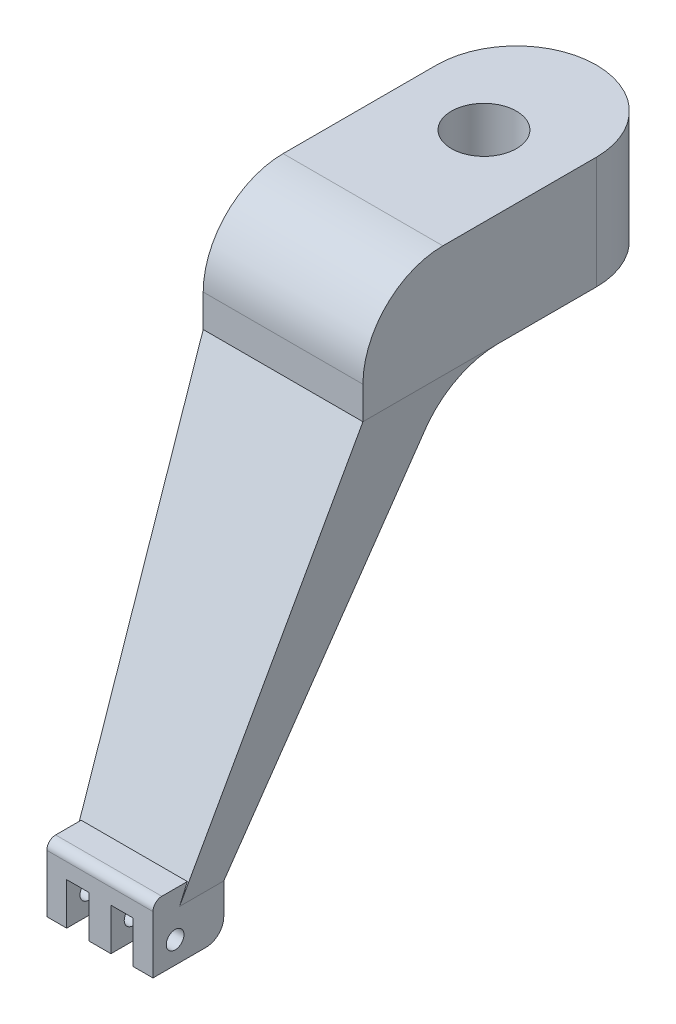
ISO-10303-21;
HEADER;
FILE_DESCRIPTION(('STEP AP214'),'2;1');
FILE_NAME('part.step','',(''),(''),'','','');
FILE_SCHEMA(('AUTOMOTIVE_DESIGN { 1 0 10303 214 1 1 1 1 }'));
ENDSEC;
DATA;
#1=APPLICATION_CONTEXT('core data for automotive mechanical design processes');
#2=APPLICATION_PROTOCOL_DEFINITION('international standard','automotive_design',2000,#1);
#3=PRODUCT_CONTEXT('',#1,'mechanical');
#4=PRODUCT('Part','Part','',(#3));
#5=PRODUCT_RELATED_PRODUCT_CATEGORY('part','',(#4));
#6=PRODUCT_DEFINITION_FORMATION('','',#4);
#7=PRODUCT_DEFINITION_CONTEXT('part definition',#1,'design');
#8=PRODUCT_DEFINITION('design','',#6,#7);
#9=PRODUCT_DEFINITION_SHAPE('','',#8);
#10=(LENGTH_UNIT() NAMED_UNIT(*) SI_UNIT(.MILLI.,.METRE.));
#11=(NAMED_UNIT(*) PLANE_ANGLE_UNIT() SI_UNIT($,.RADIAN.));
#12=(NAMED_UNIT(*) SI_UNIT($,.STERADIAN.) SOLID_ANGLE_UNIT());
#13=UNCERTAINTY_MEASURE_WITH_UNIT(LENGTH_MEASURE(1.E-05),#10,'distance_accuracy_value','');
#14=(GEOMETRIC_REPRESENTATION_CONTEXT(3) GLOBAL_UNCERTAINTY_ASSIGNED_CONTEXT((#13)) GLOBAL_UNIT_ASSIGNED_CONTEXT((#10,
#11,#12)) REPRESENTATION_CONTEXT('',''));
#15=CARTESIAN_POINT('',(0.,0.,0.));
#16=DIRECTION('',(0.,0.,1.));
#17=DIRECTION('',(1.,0.,0.));
#18=AXIS2_PLACEMENT_3D('',#15,#16,#17);
#19=CARTESIAN_POINT('',(6.00000000000001,-4.99999999999999,1.5));
#20=DIRECTION('',(-1.,0.,0.));
#21=DIRECTION('',(0.,-1.,0.));
#22=AXIS2_PLACEMENT_3D('',#19,#20,#21);
#23=CYLINDRICAL_SURFACE('',#22,1.);
#24=CARTESIAN_POINT('',(-3.75,-5.,1.5));
#25=DIRECTION('',(-1.,0.,0.));
#26=DIRECTION('',(0.,0.,1.));
#27=AXIS2_PLACEMENT_3D('',#24,#25,#26);
#28=CIRCLE('',#27,1.);
#29=CARTESIAN_POINT('',(-3.75,-5.,2.5));
#30=VERTEX_POINT('',#29);
#31=EDGE_CURVE('E583',#30,#30,#28,.F.);
#32=ORIENTED_EDGE('',*,*,#31,.T.);
#33=EDGE_LOOP('',(#32));
#34=FACE_BOUND('',#33,.T.);
#35=CARTESIAN_POINT('',(-6.,-5.,1.5));
#36=DIRECTION('',(-1.,0.,0.));
#37=DIRECTION('',(0.,-1.,0.));
#38=AXIS2_PLACEMENT_3D('',#35,#36,#37);
#39=CIRCLE('',#38,1.);
#40=CARTESIAN_POINT('',(-6.,-6.,1.5));
#41=VERTEX_POINT('',#40);
#42=EDGE_CURVE('E684',#41,#41,#39,.T.);
#43=ORIENTED_EDGE('',*,*,#42,.T.);
#44=EDGE_LOOP('',(#43));
#45=FACE_BOUND('',#44,.T.);
#46=ADVANCED_FACE('F51',(#34,#45),#23,.F.);
#47=CARTESIAN_POINT('',(3.75,-4.99999999999999,1.5));
#48=DIRECTION('',(1.,0.,0.));
#49=DIRECTION('',(0.,0.,-1.));
#50=AXIS2_PLACEMENT_3D('',#47,#48,#49);
#51=CIRCLE('',#50,1.);
#52=CARTESIAN_POINT('',(3.75,-4.99999999999999,0.500000000000001));
#53=VERTEX_POINT('',#52);
#54=EDGE_CURVE('E574',#53,#53,#51,.F.);
#55=ORIENTED_EDGE('',*,*,#54,.T.);
#56=EDGE_LOOP('',(#55));
#57=FACE_BOUND('',#56,.T.);
#58=CARTESIAN_POINT('',(6.00000000000001,-4.99999999999999,1.5));
#59=DIRECTION('',(-1.,0.,0.));
#60=DIRECTION('',(0.,-1.,0.));
#61=AXIS2_PLACEMENT_3D('',#58,#59,#60);
#62=CIRCLE('',#61,1.);
#63=CARTESIAN_POINT('',(6.00000000000001,-5.99999999999999,1.5));
#64=VERTEX_POINT('',#63);
#65=EDGE_CURVE('E586',#64,#64,#62,.T.);
#66=ORIENTED_EDGE('',*,*,#65,.F.);
#67=EDGE_LOOP('',(#66));
#68=FACE_BOUND('',#67,.T.);
#69=ADVANCED_FACE('F451',(#57,#68),#23,.F.);
#70=CARTESIAN_POINT('',(6.00000000000001,-7.5,3.5));
#71=DIRECTION('',(0.,-1.,0.));
#72=DIRECTION('',(0.,0.,-1.));
#73=AXIS2_PLACEMENT_3D('',#70,#71,#72);
#74=PLANE('',#73);
#75=DIRECTION('',(0.,0.,1.));
#76=VECTOR('',#75,1.);
#77=CARTESIAN_POINT('',(-6.,-7.5,4.));
#78=LINE('',#77,#76);
#79=CARTESIAN_POINT('',(-6.,-7.5,-2.));
#80=VERTEX_POINT('',#79);
#81=CARTESIAN_POINT('',(-6.,-7.5,4.));
#82=VERTEX_POINT('',#81);
#83=EDGE_CURVE('E703',#80,#82,#78,.T.);
#84=ORIENTED_EDGE('',*,*,#83,.F.);
#85=DIRECTION('',(-1.,0.,0.));
#86=VECTOR('',#85,1.);
#87=CARTESIAN_POINT('',(6.00000000000001,-7.5,-2.));
#88=LINE('',#87,#86);
#89=CARTESIAN_POINT('',(6.,-7.5,-2.));
#90=VERTEX_POINT('',#89);
#91=EDGE_CURVE('E664',#80,#90,#88,.F.);
#92=ORIENTED_EDGE('',*,*,#91,.T.);
#93=DIRECTION('',(0.,0.,-1.));
#94=VECTOR('',#93,1.);
#95=CARTESIAN_POINT('',(6.,-7.5,4.));
#96=LINE('',#95,#94);
#97=CARTESIAN_POINT('',(6.00000000000001,-7.5,4.));
#98=VERTEX_POINT('',#97);
#99=EDGE_CURVE('E562',#98,#90,#96,.T.);
#100=ORIENTED_EDGE('',*,*,#99,.F.);
#101=DIRECTION('',(1.,0.,0.));
#102=VECTOR('',#101,1.);
#103=CARTESIAN_POINT('',(-5.99999999999999,-7.5,4.));
#104=LINE('',#103,#102);
#105=CARTESIAN_POINT('',(3.75,-7.5,4.));
#106=VERTEX_POINT('',#105);
#107=EDGE_CURVE('E702',#106,#98,#104,.T.);
#108=ORIENTED_EDGE('',*,*,#107,.F.);
#109=DIRECTION('',(0.,0.,1.));
#110=VECTOR('',#109,1.);
#111=CARTESIAN_POINT('',(3.75,-7.5,4.));
#112=LINE('',#111,#110);
#113=CARTESIAN_POINT('',(3.75,-7.5,-1.));
#114=VERTEX_POINT('',#113);
#115=EDGE_CURVE('E736',#114,#106,#112,.T.);
#116=ORIENTED_EDGE('',*,*,#115,.F.);
#117=DIRECTION('',(1.,0.,0.));
#118=VECTOR('',#117,1.);
#119=CARTESIAN_POINT('',(3.75,-7.5,-1.));
#120=LINE('',#119,#118);
#121=CARTESIAN_POINT('',(1.25,-7.5,-1.));
#122=VERTEX_POINT('',#121);
#123=EDGE_CURVE('E733',#122,#114,#120,.T.);
#124=ORIENTED_EDGE('',*,*,#123,.F.);
#125=DIRECTION('',(0.,0.,-1.));
#126=VECTOR('',#125,1.);
#127=CARTESIAN_POINT('',(1.25,-7.5,4.));
#128=LINE('',#127,#126);
#129=CARTESIAN_POINT('',(1.25,-7.5,4.));
#130=VERTEX_POINT('',#129);
#131=EDGE_CURVE('E730',#130,#122,#128,.T.);
#132=ORIENTED_EDGE('',*,*,#131,.F.);
#133=CARTESIAN_POINT('',(-1.24999999999999,-7.5,4.));
#134=VERTEX_POINT('',#133);
#135=EDGE_CURVE('E701',#134,#130,#104,.T.);
#136=ORIENTED_EDGE('',*,*,#135,.F.);
#137=DIRECTION('',(0.,0.,1.));
#138=VECTOR('',#137,1.);
#139=CARTESIAN_POINT('',(-1.24999999999999,-7.5,4.));
#140=LINE('',#139,#138);
#141=CARTESIAN_POINT('',(-1.24999999999999,-7.5,-1.));
#142=VERTEX_POINT('',#141);
#143=EDGE_CURVE('E727',#142,#134,#140,.T.);
#144=ORIENTED_EDGE('',*,*,#143,.F.);
#145=DIRECTION('',(1.,0.,0.));
#146=VECTOR('',#145,1.);
#147=CARTESIAN_POINT('',(-3.75,-7.5,-1.));
#148=LINE('',#147,#146);
#149=CARTESIAN_POINT('',(-3.75,-7.5,-1.));
#150=VERTEX_POINT('',#149);
#151=EDGE_CURVE('E1019',#150,#142,#148,.T.);
#152=ORIENTED_EDGE('',*,*,#151,.F.);
#153=DIRECTION('',(0.,0.,-1.));
#154=VECTOR('',#153,1.);
#155=CARTESIAN_POINT('',(-3.75,-7.5,3.99999999999999));
#156=LINE('',#155,#154);
#157=CARTESIAN_POINT('',(-3.75,-7.5,3.99999999999999));
#158=VERTEX_POINT('',#157);
#159=EDGE_CURVE('E759',#158,#150,#156,.T.);
#160=ORIENTED_EDGE('',*,*,#159,.F.);
#161=EDGE_CURVE('E697',#82,#158,#104,.T.);
#162=ORIENTED_EDGE('',*,*,#161,.F.);
#163=EDGE_LOOP('',(#84,#92,#100,#108,#116,#124,#132,#136,#144,#152,#160,#162));
#164=FACE_BOUND('',#163,.T.);
#165=ADVANCED_FACE('F494',(#164),#74,.T.);
#166=CARTESIAN_POINT('',(-5.99999999999999,-23.422205101856,-4.));
#167=DIRECTION('',(0.,0.,-1.));
#168=DIRECTION('',(-1.,0.,0.));
#169=AXIS2_PLACEMENT_3D('',#166,#167,#168);
#170=PLANE('',#169);
#171=DIRECTION('',(0.,1.,0.));
#172=VECTOR('',#171,1.);
#173=CARTESIAN_POINT('',(6.00000000000001,-23.422205101856,-4.));
#174=LINE('',#173,#172);
#175=CARTESIAN_POINT('',(6.,-5.5,-4.));
#176=VERTEX_POINT('',#175);
#177=CARTESIAN_POINT('',(6.,-2.,-4.));
#178=VERTEX_POINT('',#177);
#179=EDGE_CURVE('E557',#176,#178,#174,.T.);
#180=ORIENTED_EDGE('',*,*,#179,.F.);
#181=DIRECTION('',(-1.,0.,0.));
#182=VECTOR('',#181,1.);
#183=CARTESIAN_POINT('',(-5.99999999999999,-5.5,-4.));
#184=LINE('',#183,#182);
#185=CARTESIAN_POINT('',(-6.,-5.5,-4.));
#186=VERTEX_POINT('',#185);
#187=EDGE_CURVE('E659',#176,#186,#184,.T.);
#188=ORIENTED_EDGE('',*,*,#187,.T.);
#189=DIRECTION('',(0.,1.,0.));
#190=VECTOR('',#189,1.);
#191=CARTESIAN_POINT('',(-5.99999999999999,-23.422205101856,-4.));
#192=LINE('',#191,#190);
#193=CARTESIAN_POINT('',(-6.,-2.00000000000001,-4.));
#194=VERTEX_POINT('',#193);
#195=EDGE_CURVE('E563',#186,#194,#192,.T.);
#196=ORIENTED_EDGE('',*,*,#195,.T.);
#197=DIRECTION('',(-1.,0.,0.));
#198=VECTOR('',#197,1.);
#199=CARTESIAN_POINT('',(-6.,-2.,-4.));
#200=LINE('',#199,#198);
#201=EDGE_CURVE('E292',#178,#194,#200,.T.);
#202=ORIENTED_EDGE('',*,*,#201,.F.);
#203=EDGE_LOOP('',(#180,#188,#196,#202));
#204=FACE_BOUND('',#203,.T.);
#205=ADVANCED_FACE('F490',(#204),#170,.T.);
#206=CARTESIAN_POINT('',(-5.99999999999999,-23.422205101856,4.));
#207=DIRECTION('',(-1.,0.,0.));
#208=DIRECTION('',(0.,-1.,0.));
#209=AXIS2_PLACEMENT_3D('',#206,#207,#208);
#210=PLANE('',#209);
#211=DIRECTION('',(0.,1.,0.));
#212=VECTOR('',#211,1.);
#213=CARTESIAN_POINT('',(-5.99999999999999,-23.422205101856,4.));
#214=LINE('',#213,#212);
#215=CARTESIAN_POINT('',(-6.,-1.,4.));
#216=VERTEX_POINT('',#215);
#217=EDGE_CURVE('E706',#82,#216,#214,.T.);
#218=ORIENTED_EDGE('',*,*,#217,.T.);
#219=CARTESIAN_POINT('',(-6.,-1.,3.));
#220=DIRECTION('',(-1.,0.,0.));
#221=DIRECTION('',(0.,-1.,0.));
#222=AXIS2_PLACEMENT_3D('',#219,#220,#221);
#223=CIRCLE('',#222,1.);
#224=CARTESIAN_POINT('',(-6.,0.,3.));
#225=VERTEX_POINT('',#224);
#226=EDGE_CURVE('E12',#216,#225,#223,.T.);
#227=ORIENTED_EDGE('',*,*,#226,.T.);
#228=DIRECTION('',(0.,0.,1.));
#229=VECTOR('',#228,1.);
#230=CARTESIAN_POINT('',(-6.,0.,4.));
#231=LINE('',#230,#229);
#232=CARTESIAN_POINT('',(-6.,0.,0.117206982543637));
#233=VERTEX_POINT('',#232);
#234=EDGE_CURVE('E679',#233,#225,#231,.T.);
#235=ORIENTED_EDGE('',*,*,#234,.F.);
#236=DIRECTION('',(0.,0.914843446280746,-0.403808703221177));
#237=VECTOR('',#236,1.);
#238=CARTESIAN_POINT('',(-5.99999999999999,-21.0373341101522,9.40301281171306));
#239=LINE('',#238,#237);
#240=CARTESIAN_POINT('',(-6.,-2.,0.999999999999997));
#241=VERTEX_POINT('',#240);
#242=EDGE_CURVE('E742',#241,#233,#239,.T.);
#243=ORIENTED_EDGE('',*,*,#242,.F.);
#244=DIRECTION('',(0.,0.,1.));
#245=VECTOR('',#244,1.);
#246=CARTESIAN_POINT('',(-6.,-2.,0.999999999999997));
#247=LINE('',#246,#245);
#248=EDGE_CURVE('E476',#194,#241,#247,.T.);
#249=ORIENTED_EDGE('',*,*,#248,.F.);
#250=ORIENTED_EDGE('',*,*,#195,.F.);
#251=CARTESIAN_POINT('',(-6.,-5.5,-2.));
#252=DIRECTION('',(-1.,0.,0.));
#253=DIRECTION('',(0.,-1.,0.));
#254=AXIS2_PLACEMENT_3D('',#251,#252,#253);
#255=CIRCLE('',#254,2.);
#256=EDGE_CURVE('E662',#186,#80,#255,.T.);
#257=ORIENTED_EDGE('',*,*,#256,.T.);
#258=ORIENTED_EDGE('',*,*,#83,.T.);
#259=EDGE_LOOP('',(#218,#227,#235,#243,#249,#250,#257,#258));
#260=FACE_BOUND('',#259,.T.);
#261=ORIENTED_EDGE('',*,*,#42,.F.);
#262=EDGE_LOOP('',(#261));
#263=FACE_BOUND('',#262,.T.);
#264=ADVANCED_FACE('F481',(#260,#263),#210,.T.);
#265=CARTESIAN_POINT('',(-5.99999999999999,-23.422205101856,4.));
#266=DIRECTION('',(0.,0.,1.));
#267=DIRECTION('',(1.,0.,0.));
#268=AXIS2_PLACEMENT_3D('',#265,#266,#267);
#269=PLANE('',#268);
#270=DIRECTION('',(0.,1.,0.));
#271=VECTOR('',#270,1.);
#272=CARTESIAN_POINT('',(6.00000000000001,-23.422205101856,4.));
#273=LINE('',#272,#271);
#274=CARTESIAN_POINT('',(6.,-0.999999999999994,4.));
#275=VERTEX_POINT('',#274);
#276=EDGE_CURVE('E696',#98,#275,#273,.T.);
#277=ORIENTED_EDGE('',*,*,#276,.T.);
#278=DIRECTION('',(1.,0.,0.));
#279=VECTOR('',#278,1.);
#280=CARTESIAN_POINT('',(-6.,-1.,4.));
#281=LINE('',#280,#279);
#282=EDGE_CURVE('E60',#275,#216,#281,.F.);
#283=ORIENTED_EDGE('',*,*,#282,.T.);
#284=ORIENTED_EDGE('',*,*,#217,.F.);
#285=ORIENTED_EDGE('',*,*,#161,.T.);
#286=DIRECTION('',(0.,-1.,0.));
#287=VECTOR('',#286,1.);
#288=CARTESIAN_POINT('',(-3.75,3.09016994374947,3.99999999999999));
#289=LINE('',#288,#287);
#290=CARTESIAN_POINT('',(-3.75,-2.75,3.99999999999999));
#291=VERTEX_POINT('',#290);
#292=EDGE_CURVE('E1010',#291,#158,#289,.T.);
#293=ORIENTED_EDGE('',*,*,#292,.F.);
#294=DIRECTION('',(1.,0.,0.));
#295=VECTOR('',#294,1.);
#296=CARTESIAN_POINT('',(-3.75,-2.75,3.99999999999999));
#297=LINE('',#296,#295);
#298=CARTESIAN_POINT('',(-1.24999999999999,-2.75,4.));
#299=VERTEX_POINT('',#298);
#300=EDGE_CURVE('E1009',#291,#299,#297,.T.);
#301=ORIENTED_EDGE('',*,*,#300,.T.);
#302=DIRECTION('',(0.,-1.,0.));
#303=VECTOR('',#302,1.);
#304=CARTESIAN_POINT('',(-1.24999999999999,3.09016994374947,4.));
#305=LINE('',#304,#303);
#306=EDGE_CURVE('E721',#299,#134,#305,.T.);
#307=ORIENTED_EDGE('',*,*,#306,.T.);
#308=ORIENTED_EDGE('',*,*,#135,.T.);
#309=DIRECTION('',(0.,-1.,0.));
#310=VECTOR('',#309,1.);
#311=CARTESIAN_POINT('',(1.25,3.09016994374947,4.));
#312=LINE('',#311,#310);
#313=CARTESIAN_POINT('',(1.25,-2.75,4.));
#314=VERTEX_POINT('',#313);
#315=EDGE_CURVE('E719',#314,#130,#312,.T.);
#316=ORIENTED_EDGE('',*,*,#315,.F.);
#317=DIRECTION('',(1.,0.,0.));
#318=VECTOR('',#317,1.);
#319=CARTESIAN_POINT('',(3.75,-2.75,4.));
#320=LINE('',#319,#318);
#321=CARTESIAN_POINT('',(3.75,-2.75,4.));
#322=VERTEX_POINT('',#321);
#323=EDGE_CURVE('E757',#314,#322,#320,.T.);
#324=ORIENTED_EDGE('',*,*,#323,.T.);
#325=DIRECTION('',(0.,-1.,0.));
#326=VECTOR('',#325,1.);
#327=CARTESIAN_POINT('',(3.75,3.09016994374947,4.));
#328=LINE('',#327,#326);
#329=EDGE_CURVE('E740',#322,#106,#328,.T.);
#330=ORIENTED_EDGE('',*,*,#329,.T.);
#331=ORIENTED_EDGE('',*,*,#107,.T.);
#332=EDGE_LOOP('',(#277,#283,#284,#285,#293,#301,#307,#308,#316,#324,#330,#331));
#333=FACE_BOUND('',#332,.T.);
#334=ADVANCED_FACE('F459',(#333),#269,.T.);
#335=CARTESIAN_POINT('',(6.00000000000001,-23.422205101856,4.));
#336=DIRECTION('',(1.,0.,0.));
#337=DIRECTION('',(0.,1.,0.));
#338=AXIS2_PLACEMENT_3D('',#335,#336,#337);
#339=PLANE('',#338);
#340=DIRECTION('',(0.,0.,-1.));
#341=VECTOR('',#340,1.);
#342=CARTESIAN_POINT('',(6.,0.,4.));
#343=LINE('',#342,#341);
#344=CARTESIAN_POINT('',(6.,0.,3.));
#345=VERTEX_POINT('',#344);
#346=CARTESIAN_POINT('',(6.,0.,0.117206982543636));
#347=VERTEX_POINT('',#346);
#348=EDGE_CURVE('E678',#345,#347,#343,.T.);
#349=ORIENTED_EDGE('',*,*,#348,.F.);
#350=CARTESIAN_POINT('',(6.,-0.999999999999995,3.));
#351=DIRECTION('',(1.,0.,0.));
#352=DIRECTION('',(0.,1.,0.));
#353=AXIS2_PLACEMENT_3D('',#350,#351,#352);
#354=CIRCLE('',#353,1.);
#355=EDGE_CURVE('E74',#345,#275,#354,.T.);
#356=ORIENTED_EDGE('',*,*,#355,.T.);
#357=ORIENTED_EDGE('',*,*,#276,.F.);
#358=ORIENTED_EDGE('',*,*,#99,.T.);
#359=CARTESIAN_POINT('',(6.,-5.5,-2.));
#360=DIRECTION('',(1.,0.,0.));
#361=DIRECTION('',(0.,1.,0.));
#362=AXIS2_PLACEMENT_3D('',#359,#360,#361);
#363=CIRCLE('',#362,2.);
#364=EDGE_CURVE('E667',#90,#176,#363,.T.);
#365=ORIENTED_EDGE('',*,*,#364,.T.);
#366=ORIENTED_EDGE('',*,*,#179,.T.);
#367=DIRECTION('',(0.,0.,-1.));
#368=VECTOR('',#367,1.);
#369=CARTESIAN_POINT('',(6.,-2.,0.999999999999997));
#370=LINE('',#369,#368);
#371=CARTESIAN_POINT('',(6.,-2.,0.999999999999997));
#372=VERTEX_POINT('',#371);
#373=EDGE_CURVE('E308',#372,#178,#370,.T.);
#374=ORIENTED_EDGE('',*,*,#373,.F.);
#375=DIRECTION('',(0.,-0.914843446280746,0.403808703221177));
#376=VECTOR('',#375,1.);
#377=CARTESIAN_POINT('',(6.00000000000001,-21.0373341101522,9.40301281171306));
#378=LINE('',#377,#376);
#379=EDGE_CURVE('E377',#347,#372,#378,.T.);
#380=ORIENTED_EDGE('',*,*,#379,.F.);
#381=EDGE_LOOP('',(#349,#356,#357,#358,#365,#366,#374,#380));
#382=FACE_BOUND('',#381,.T.);
#383=ORIENTED_EDGE('',*,*,#65,.T.);
#384=EDGE_LOOP('',(#383));
#385=FACE_BOUND('',#384,.T.);
#386=ADVANCED_FACE('F454',(#382,#385),#339,.T.);
#387=CARTESIAN_POINT('',(3.5,0.,-1.));
#388=DIRECTION('',(0.,-1.,0.));
#389=DIRECTION('',(1.,0.,0.));
#390=AXIS2_PLACEMENT_3D('',#387,#388,#389);
#391=PLANE('',#390);
#392=ORIENTED_EDGE('',*,*,#234,.T.);
#393=DIRECTION('',(1.,0.,0.));
#394=VECTOR('',#393,1.);
#395=CARTESIAN_POINT('',(6.,0.,3.));
#396=LINE('',#395,#394);
#397=EDGE_CURVE('E670',#225,#345,#396,.T.);
#398=ORIENTED_EDGE('',*,*,#397,.T.);
#399=ORIENTED_EDGE('',*,*,#348,.T.);
#400=DIRECTION('',(-1.,0.,0.));
#401=VECTOR('',#400,1.);
#402=CARTESIAN_POINT('',(3.5,0.,0.117206982543636));
#403=LINE('',#402,#401);
#404=EDGE_CURVE('E561',#347,#233,#403,.T.);
#405=ORIENTED_EDGE('',*,*,#404,.T.);
#406=EDGE_LOOP('',(#392,#398,#399,#405));
#407=FACE_BOUND('',#406,.T.);
#408=ADVANCED_FACE('F446',(#407),#391,.F.);
#409=CARTESIAN_POINT('',(3.75,3.09016994374947,4.));
#410=DIRECTION('',(1.,0.,0.));
#411=DIRECTION('',(0.,0.,-1.));
#412=AXIS2_PLACEMENT_3D('',#409,#410,#411);
#413=PLANE('',#412);
#414=DIRECTION('',(0.,0.,-1.));
#415=VECTOR('',#414,1.);
#416=CARTESIAN_POINT('',(3.75,-2.75,4.));
#417=LINE('',#416,#415);
#418=CARTESIAN_POINT('',(3.75,-2.75,-1.));
#419=VERTEX_POINT('',#418);
#420=EDGE_CURVE('E760',#322,#419,#417,.T.);
#421=ORIENTED_EDGE('',*,*,#420,.T.);
#422=DIRECTION('',(0.,-1.,0.));
#423=VECTOR('',#422,1.);
#424=CARTESIAN_POINT('',(3.75,3.09016994374947,-1.));
#425=LINE('',#424,#423);
#426=EDGE_CURVE('E746',#419,#114,#425,.T.);
#427=ORIENTED_EDGE('',*,*,#426,.T.);
#428=ORIENTED_EDGE('',*,*,#115,.T.);
#429=ORIENTED_EDGE('',*,*,#329,.F.);
#430=EDGE_LOOP('',(#421,#427,#428,#429));
#431=FACE_BOUND('',#430,.T.);
#432=ORIENTED_EDGE('',*,*,#54,.F.);
#433=EDGE_LOOP('',(#432));
#434=FACE_BOUND('',#433,.T.);
#435=ADVANCED_FACE('F442',(#431,#434),#413,.F.);
#436=CARTESIAN_POINT('',(1.25,3.09016994374947,4.));
#437=DIRECTION('',(-1.,0.,0.));
#438=DIRECTION('',(0.,0.,1.));
#439=AXIS2_PLACEMENT_3D('',#436,#437,#438);
#440=PLANE('',#439);
#441=DIRECTION('',(0.,0.,1.));
#442=VECTOR('',#441,1.);
#443=CARTESIAN_POINT('',(1.25,-2.75,4.));
#444=LINE('',#443,#442);
#445=CARTESIAN_POINT('',(1.25,-2.75,-1.));
#446=VERTEX_POINT('',#445);
#447=EDGE_CURVE('E749',#446,#314,#444,.T.);
#448=ORIENTED_EDGE('',*,*,#447,.T.);
#449=ORIENTED_EDGE('',*,*,#315,.T.);
#450=ORIENTED_EDGE('',*,*,#131,.T.);
#451=DIRECTION('',(0.,-1.,0.));
#452=VECTOR('',#451,1.);
#453=CARTESIAN_POINT('',(1.25,3.09016994374947,-1.));
#454=LINE('',#453,#452);
#455=EDGE_CURVE('E750',#446,#122,#454,.T.);
#456=ORIENTED_EDGE('',*,*,#455,.F.);
#457=EDGE_LOOP('',(#448,#449,#450,#456));
#458=FACE_BOUND('',#457,.T.);
#459=CARTESIAN_POINT('',(1.25,-5.,1.5));
#460=DIRECTION('',(-1.,0.,0.));
#461=DIRECTION('',(0.,0.,1.));
#462=AXIS2_PLACEMENT_3D('',#459,#460,#461);
#463=CIRCLE('',#462,1.);
#464=CARTESIAN_POINT('',(1.25,-5.,2.5));
#465=VERTEX_POINT('',#464);
#466=EDGE_CURVE('E570',#465,#465,#463,.F.);
#467=ORIENTED_EDGE('',*,*,#466,.F.);
#468=EDGE_LOOP('',(#467));
#469=FACE_BOUND('',#468,.T.);
#470=ADVANCED_FACE('F438',(#458,#469),#440,.F.);
#471=CARTESIAN_POINT('',(3.75,3.09016994374947,-1.));
#472=DIRECTION('',(0.,0.,-1.));
#473=DIRECTION('',(-1.,0.,0.));
#474=AXIS2_PLACEMENT_3D('',#471,#472,#473);
#475=PLANE('',#474);
#476=DIRECTION('',(-1.,0.,0.));
#477=VECTOR('',#476,1.);
#478=CARTESIAN_POINT('',(3.75,-2.75,-1.));
#479=LINE('',#478,#477);
#480=EDGE_CURVE('E1039',#419,#446,#479,.T.);
#481=ORIENTED_EDGE('',*,*,#480,.T.);
#482=ORIENTED_EDGE('',*,*,#455,.T.);
#483=ORIENTED_EDGE('',*,*,#123,.T.);
#484=ORIENTED_EDGE('',*,*,#426,.F.);
#485=EDGE_LOOP('',(#481,#482,#483,#484));
#486=FACE_BOUND('',#485,.T.);
#487=ADVANCED_FACE('F434',(#486),#475,.F.);
#488=CARTESIAN_POINT('',(1.5,-2.75,4.99999999999999));
#489=DIRECTION('',(0.,-1.,0.));
#490=DIRECTION('',(0.,0.,-1.));
#491=AXIS2_PLACEMENT_3D('',#488,#489,#490);
#492=PLANE('',#491);
#493=ORIENTED_EDGE('',*,*,#420,.F.);
#494=ORIENTED_EDGE('',*,*,#323,.F.);
#495=ORIENTED_EDGE('',*,*,#447,.F.);
#496=ORIENTED_EDGE('',*,*,#480,.F.);
#497=EDGE_LOOP('',(#493,#494,#495,#496));
#498=FACE_BOUND('',#497,.T.);
#499=ADVANCED_FACE('F430',(#498),#492,.T.);
#500=CARTESIAN_POINT('',(-3.75,3.09016994374947,3.99999999999999));
#501=DIRECTION('',(-1.,0.,0.));
#502=DIRECTION('',(0.,0.,1.));
#503=AXIS2_PLACEMENT_3D('',#500,#501,#502);
#504=PLANE('',#503);
#505=DIRECTION('',(0.,0.,1.));
#506=VECTOR('',#505,1.);
#507=CARTESIAN_POINT('',(-3.75,-2.75,3.99999999999999));
#508=LINE('',#507,#506);
#509=CARTESIAN_POINT('',(-3.75,-2.75,-1.));
#510=VERTEX_POINT('',#509);
#511=EDGE_CURVE('E1013',#510,#291,#508,.T.);
#512=ORIENTED_EDGE('',*,*,#511,.T.);
#513=ORIENTED_EDGE('',*,*,#292,.T.);
#514=ORIENTED_EDGE('',*,*,#159,.T.);
#515=DIRECTION('',(0.,-1.,0.));
#516=VECTOR('',#515,1.);
#517=CARTESIAN_POINT('',(-3.75,3.09016994374947,-1.));
#518=LINE('',#517,#516);
#519=EDGE_CURVE('E1025',#510,#150,#518,.T.);
#520=ORIENTED_EDGE('',*,*,#519,.F.);
#521=EDGE_LOOP('',(#512,#513,#514,#520));
#522=FACE_BOUND('',#521,.T.);
#523=ORIENTED_EDGE('',*,*,#31,.F.);
#524=EDGE_LOOP('',(#523));
#525=FACE_BOUND('',#524,.T.);
#526=ADVANCED_FACE('F423',(#522,#525),#504,.F.);
#527=CARTESIAN_POINT('',(-1.24999999999999,3.09016994374947,4.));
#528=DIRECTION('',(1.,0.,0.));
#529=DIRECTION('',(0.,0.,-1.));
#530=AXIS2_PLACEMENT_3D('',#527,#528,#529);
#531=PLANE('',#530);
#532=DIRECTION('',(0.,0.,-1.));
#533=VECTOR('',#532,1.);
#534=CARTESIAN_POINT('',(-1.24999999999999,-2.75,4.));
#535=LINE('',#534,#533);
#536=CARTESIAN_POINT('',(-1.24999999999999,-2.75,-1.));
#537=VERTEX_POINT('',#536);
#538=EDGE_CURVE('E1006',#299,#537,#535,.T.);
#539=ORIENTED_EDGE('',*,*,#538,.T.);
#540=DIRECTION('',(0.,-1.,0.));
#541=VECTOR('',#540,1.);
#542=CARTESIAN_POINT('',(-1.24999999999999,3.09016994374947,-1.));
#543=LINE('',#542,#541);
#544=EDGE_CURVE('E1030',#537,#142,#543,.T.);
#545=ORIENTED_EDGE('',*,*,#544,.T.);
#546=ORIENTED_EDGE('',*,*,#143,.T.);
#547=ORIENTED_EDGE('',*,*,#306,.F.);
#548=EDGE_LOOP('',(#539,#545,#546,#547));
#549=FACE_BOUND('',#548,.T.);
#550=CARTESIAN_POINT('',(-1.24999999999999,-5.,1.5));
#551=DIRECTION('',(1.,0.,0.));
#552=DIRECTION('',(0.,0.,-1.));
#553=AXIS2_PLACEMENT_3D('',#550,#551,#552);
#554=CIRCLE('',#553,1.);
#555=CARTESIAN_POINT('',(-1.24999999999999,-5.,0.500000000000001));
#556=VERTEX_POINT('',#555);
#557=EDGE_CURVE('E579',#556,#556,#554,.F.);
#558=ORIENTED_EDGE('',*,*,#557,.F.);
#559=EDGE_LOOP('',(#558));
#560=FACE_BOUND('',#559,.T.);
#561=ADVANCED_FACE('F420',(#549,#560),#531,.F.);
#562=CARTESIAN_POINT('',(-3.75,3.09016994374947,-1.));
#563=DIRECTION('',(0.,0.,-1.));
#564=DIRECTION('',(-1.,0.,0.));
#565=AXIS2_PLACEMENT_3D('',#562,#563,#564);
#566=PLANE('',#565);
#567=DIRECTION('',(-1.,0.,0.));
#568=VECTOR('',#567,1.);
#569=CARTESIAN_POINT('',(-3.75,-2.75,-1.));
#570=LINE('',#569,#568);
#571=EDGE_CURVE('E575',#537,#510,#570,.T.);
#572=ORIENTED_EDGE('',*,*,#571,.T.);
#573=ORIENTED_EDGE('',*,*,#519,.T.);
#574=ORIENTED_EDGE('',*,*,#151,.T.);
#575=ORIENTED_EDGE('',*,*,#544,.F.);
#576=EDGE_LOOP('',(#572,#573,#574,#575));
#577=FACE_BOUND('',#576,.T.);
#578=ADVANCED_FACE('F418',(#577),#566,.F.);
#579=CARTESIAN_POINT('',(1.5,-2.75,4.99999999999999));
#580=DIRECTION('',(0.,-1.,0.));
#581=DIRECTION('',(0.,0.,-1.));
#582=AXIS2_PLACEMENT_3D('',#579,#580,#581);
#583=PLANE('',#582);
#584=ORIENTED_EDGE('',*,*,#511,.F.);
#585=ORIENTED_EDGE('',*,*,#571,.F.);
#586=ORIENTED_EDGE('',*,*,#538,.F.);
#587=ORIENTED_EDGE('',*,*,#300,.F.);
#588=EDGE_LOOP('',(#584,#585,#586,#587));
#589=FACE_BOUND('',#588,.T.);
#590=ADVANCED_FACE('F414',(#589),#583,.T.);
#591=ORIENTED_EDGE('',*,*,#557,.T.);
#592=EDGE_LOOP('',(#591));
#593=FACE_BOUND('',#592,.T.);
#594=ORIENTED_EDGE('',*,*,#466,.T.);
#595=EDGE_LOOP('',(#594));
#596=FACE_BOUND('',#595,.T.);
#597=ADVANCED_FACE('F417',(#593,#596),#23,.F.);
#598=CARTESIAN_POINT('',(0.,-2.20018838600292,-3.88667639994349));
#599=DIRECTION('',(0.,-0.492629230366606,-0.870239301220305));
#600=DIRECTION('',(0.,0.870239301220305,-0.492629230366606));
#601=AXIS2_PLACEMENT_3D('',#598,#599,#600);
#602=PLANE('',#601);
#603=DIRECTION('',(0.0655067245618095,-0.868370138453709,0.491571125758084));
#604=VECTOR('',#603,1.);
#605=CARTESIAN_POINT('',(-9.02499998400002,38.1,-26.7));
#606=LINE('',#605,#604);
#607=CARTESIAN_POINT('',(-8.67938369902973,33.5184419502105,-24.1064496825381));
#608=VERTEX_POINT('',#607);
#609=EDGE_CURVE('E350',#608,#194,#606,.T.);
#610=ORIENTED_EDGE('',*,*,#609,.F.);
#611=DIRECTION('',(-1.,0.,0.));
#612=VECTOR('',#611,1.);
#613=CARTESIAN_POINT('',(0.,33.5184419502105,-24.1064496825381));
#614=LINE('',#613,#612);
#615=CARTESIAN_POINT('',(8.6793836990297,33.5184419502105,-24.1064496825381));
#616=VERTEX_POINT('',#615);
#617=EDGE_CURVE('E653',#608,#616,#614,.F.);
#618=ORIENTED_EDGE('',*,*,#617,.T.);
#619=DIRECTION('',(-0.0655067245618088,-0.868370138453709,0.491571125758084));
#620=VECTOR('',#619,1.);
#621=CARTESIAN_POINT('',(9.02499998399998,38.1,-26.7));
#622=LINE('',#621,#620);
#623=EDGE_CURVE('E327',#616,#178,#622,.T.);
#624=ORIENTED_EDGE('',*,*,#623,.T.);
#625=ORIENTED_EDGE('',*,*,#201,.T.);
#626=EDGE_LOOP('',(#610,#618,#624,#625));
#627=FACE_BOUND('',#626,.T.);
#628=ADVANCED_FACE('F268',(#627),#602,.T.);
#629=CARTESIAN_POINT('',(-6.11606840186876,-0.461374234857756,0.));
#630=DIRECTION('',(-0.997166760646095,-0.0752226791770521,0.));
#631=DIRECTION('',(0.0752226791770521,-0.997166760646095,0.));
#632=AXIS2_PLACEMENT_3D('',#629,#630,#631);
#633=PLANE('',#632);
#634=DIRECTION('',(0.,0.,1.));
#635=VECTOR('',#634,1.);
#636=CARTESIAN_POINT('',(-9.02499998400002,38.1,-16.7));
#637=LINE('',#636,#635);
#638=CARTESIAN_POINT('',(-9.02499998400002,38.1,-26.7));
#639=VERTEX_POINT('',#638);
#640=CARTESIAN_POINT('',(-9.02499998400002,38.1,-16.7));
#641=VERTEX_POINT('',#640);
#642=EDGE_CURVE('E225',#639,#641,#637,.T.);
#643=ORIENTED_EDGE('',*,*,#642,.F.);
#644=CARTESIAN_POINT('',(-9.02499998400002,38.1,-26.7));
#645=DIRECTION('',(0.,0.,-1.));
#646=VECTOR('',#645,1.);
#647=LINE('',#644,#646);
#648=CARTESIAN_POINT('',(-9.02499998400002,38.1,-31.9647060241417));
#649=VERTEX_POINT('',#648);
#650=EDGE_CURVE('E220',#639,#649,#647,.T.);
#651=ORIENTED_EDGE('',*,*,#650,.T.);
#652=CARTESIAN_POINT('',(-8.34380921453567,29.07,-31.9647105725574));
#653=DIRECTION('',(-0.997166760646095,-0.0752226791770521,0.));
#654=DIRECTION('',(-0.0752226791770521,0.997166760646095,0.));
#655=AXIS2_PLACEMENT_3D('',#652,#653,#654);
#656=ELLIPSE('',#655,9.05565684334402,9.03);
#657=EDGE_CURVE('E554',#649,#608,#656,.F.);
#658=ORIENTED_EDGE('',*,*,#657,.T.);
#659=ORIENTED_EDGE('',*,*,#609,.T.);
#660=ORIENTED_EDGE('',*,*,#248,.T.);
#661=DIRECTION('',(0.068848744908663,-0.912672623285994,0.402850509530227));
#662=VECTOR('',#661,1.);
#663=CARTESIAN_POINT('',(-9.02499998400002,38.1,-16.7));
#664=LINE('',#663,#662);
#665=EDGE_CURVE('E242',#641,#241,#664,.T.);
#666=ORIENTED_EDGE('',*,*,#665,.F.);
#667=EDGE_LOOP('',(#643,#651,#658,#659,#660,#666));
#668=FACE_BOUND('',#667,.T.);
#669=ADVANCED_FACE('F240',(#668),#633,.T.);
#670=CARTESIAN_POINT('',(6.11606840186876,-0.46137423485775,0.));
#671=DIRECTION('',(0.997166760646095,-0.0752226791770512,0.));
#672=DIRECTION('',(0.0752226791770512,0.997166760646095,0.));
#673=AXIS2_PLACEMENT_3D('',#670,#671,#672);
#674=PLANE('',#673);
#675=DIRECTION('',(-0.0688487449086622,-0.912672623285994,0.402850509530227));
#676=VECTOR('',#675,1.);
#677=CARTESIAN_POINT('',(9.02499998399998,38.1,-16.7));
#678=LINE('',#677,#676);
#679=CARTESIAN_POINT('',(9.02499998399998,38.1,-16.7));
#680=VERTEX_POINT('',#679);
#681=EDGE_CURVE('E364',#680,#372,#678,.T.);
#682=ORIENTED_EDGE('',*,*,#681,.T.);
#683=ORIENTED_EDGE('',*,*,#373,.T.);
#684=ORIENTED_EDGE('',*,*,#623,.F.);
#685=CARTESIAN_POINT('',(8.34380921453565,29.07,-31.9647105725574));
#686=DIRECTION('',(0.997166760646095,-0.0752226791770512,0.));
#687=DIRECTION('',(-0.0752226791770512,-0.997166760646095,0.));
#688=AXIS2_PLACEMENT_3D('',#685,#686,#687);
#689=ELLIPSE('',#688,9.05565684334402,9.03);
#690=CARTESIAN_POINT('',(9.02499998399998,38.1,-31.9647105725574));
#691=VERTEX_POINT('',#690);
#692=EDGE_CURVE('E235',#616,#691,#689,.F.);
#693=ORIENTED_EDGE('',*,*,#692,.T.);
#694=CARTESIAN_POINT('',(9.02499998399998,38.1,-26.7));
#695=DIRECTION('',(0.,0.,-1.));
#696=VECTOR('',#695,1.);
#697=LINE('',#694,#696);
#698=CARTESIAN_POINT('',(9.02499998399998,38.1,-26.7));
#699=VERTEX_POINT('',#698);
#700=EDGE_CURVE('E234',#699,#691,#697,.T.);
#701=ORIENTED_EDGE('',*,*,#700,.F.);
#702=DIRECTION('',(0.,0.,-1.));
#703=VECTOR('',#702,1.);
#704=CARTESIAN_POINT('',(9.02499998399998,38.1,-16.7));
#705=LINE('',#704,#703);
#706=EDGE_CURVE('E245',#680,#699,#705,.T.);
#707=ORIENTED_EDGE('',*,*,#706,.F.);
#708=EDGE_LOOP('',(#682,#683,#684,#693,#701,#707));
#709=FACE_BOUND('',#708,.T.);
#710=ADVANCED_FACE('F267',(#709),#674,.T.);
#711=CARTESIAN_POINT('',(0.,0.0432988080986819,0.0980950398167879));
#712=DIRECTION('',(0.,0.403808703221177,0.914843446280745));
#713=DIRECTION('',(0.,-0.914843446280746,0.403808703221177));
#714=AXIS2_PLACEMENT_3D('',#711,#712,#713);
#715=PLANE('',#714);
#716=ORIENTED_EDGE('',*,*,#665,.T.);
#717=ORIENTED_EDGE('',*,*,#242,.T.);
#718=ORIENTED_EDGE('',*,*,#404,.F.);
#719=ORIENTED_EDGE('',*,*,#379,.T.);
#720=ORIENTED_EDGE('',*,*,#681,.F.);
#721=DIRECTION('',(1.,0.,0.));
#722=VECTOR('',#721,1.);
#723=CARTESIAN_POINT('',(-9.02499998400002,38.1,-16.7));
#724=LINE('',#723,#722);
#725=EDGE_CURVE('E322',#641,#680,#724,.T.);
#726=ORIENTED_EDGE('',*,*,#725,.F.);
#727=EDGE_LOOP('',(#716,#717,#718,#719,#720,#726));
#728=FACE_BOUND('',#727,.T.);
#729=ADVANCED_FACE('F373',(#728),#715,.T.);
#730=CARTESIAN_POINT('',(0.,38.1,0.));
#731=DIRECTION('',(0.,1.,0.));
#732=DIRECTION('',(-1.,0.,0.));
#733=AXIS2_PLACEMENT_3D('',#730,#731,#732);
#734=PLANE('',#733);
#735=CARTESIAN_POINT('',(0.,38.1,-39.4));
#736=DIRECTION('',(0.,1.,0.));
#737=DIRECTION('',(-1.,0.,0.));
#738=AXIS2_PLACEMENT_3D('',#735,#736,#737);
#739=CIRCLE('',#738,3.675);
#740=CARTESIAN_POINT('',(-3.67500000000002,38.1,-39.4));
#741=VERTEX_POINT('',#740);
#742=EDGE_CURVE('E617',#741,#741,#739,.T.);
#743=ORIENTED_EDGE('',*,*,#742,.T.);
#744=EDGE_LOOP('',(#743));
#745=FACE_BOUND('',#744,.T.);
#746=DIRECTION('',(0.,0.,-1.));
#747=VECTOR('',#746,1.);
#748=CARTESIAN_POINT('',(9.02499998399998,38.1,-16.7));
#749=LINE('',#748,#747);
#750=CARTESIAN_POINT('',(9.02499998399998,38.1,-43.075000016));
#751=VERTEX_POINT('',#750);
#752=EDGE_CURVE('E389',#691,#751,#749,.T.);
#753=ORIENTED_EDGE('',*,*,#752,.F.);
#754=DIRECTION('',(-1.,0.,0.));
#755=VECTOR('',#754,1.);
#756=CARTESIAN_POINT('',(0.,38.1,-31.9647105725574));
#757=LINE('',#756,#755);
#758=EDGE_CURVE('E347',#691,#649,#757,.T.);
#759=ORIENTED_EDGE('',*,*,#758,.T.);
#760=DIRECTION('',(0.,0.,1.));
#761=VECTOR('',#760,1.);
#762=CARTESIAN_POINT('',(-9.02499998400002,38.1,-16.7));
#763=LINE('',#762,#761);
#764=CARTESIAN_POINT('',(-9.02499998400002,38.1,-43.075000016));
#765=VERTEX_POINT('',#764);
#766=EDGE_CURVE('E229',#765,#649,#763,.T.);
#767=ORIENTED_EDGE('',*,*,#766,.F.);
#768=CARTESIAN_POINT('',(0.,38.1,-43.075000016));
#769=DIRECTION('',(0.,1.,0.));
#770=DIRECTION('',(-1.,0.,0.));
#771=AXIS2_PLACEMENT_3D('',#768,#769,#770);
#772=CIRCLE('',#771,9.024999984);
#773=CARTESIAN_POINT('',(0.,38.1,-52.1));
#774=VERTEX_POINT('',#773);
#775=EDGE_CURVE('E599',#765,#774,#772,.F.);
#776=ORIENTED_EDGE('',*,*,#775,.T.);
#777=CARTESIAN_POINT('',(0.,38.1,-43.075000016));
#778=DIRECTION('',(0.,1.,0.));
#779=DIRECTION('',(-1.,0.,0.));
#780=AXIS2_PLACEMENT_3D('',#777,#778,#779);
#781=CIRCLE('',#780,9.024999984);
#782=EDGE_CURVE('E593',#774,#751,#781,.F.);
#783=ORIENTED_EDGE('',*,*,#782,.T.);
#784=EDGE_LOOP('',(#753,#759,#767,#776,#783));
#785=FACE_BOUND('',#784,.T.);
#786=ADVANCED_FACE('F413',(#745,#785),#734,.F.);
#787=CARTESIAN_POINT('',(0.,50.8,0.));
#788=DIRECTION('',(0.,1.,0.));
#789=DIRECTION('',(-1.,0.,0.));
#790=AXIS2_PLACEMENT_3D('',#787,#788,#789);
#791=PLANE('',#790);
#792=DIRECTION('',(0.,0.,1.));
#793=VECTOR('',#792,1.);
#794=CARTESIAN_POINT('',(-9.02499998400003,50.8,-16.7));
#795=LINE('',#794,#793);
#796=CARTESIAN_POINT('',(-9.02499998400003,50.8,-43.075000016));
#797=VERTEX_POINT('',#796);
#798=CARTESIAN_POINT('',(-9.02499998400003,50.8,-25.73));
#799=VERTEX_POINT('',#798);
#800=EDGE_CURVE('E393',#797,#799,#795,.T.);
#801=ORIENTED_EDGE('',*,*,#800,.T.);
#802=DIRECTION('',(1.,0.,0.));
#803=VECTOR('',#802,1.);
#804=CARTESIAN_POINT('',(9.02499998399997,50.8,-25.73));
#805=LINE('',#804,#803);
#806=CARTESIAN_POINT('',(9.02499998399997,50.8,-25.73));
#807=VERTEX_POINT('',#806);
#808=EDGE_CURVE('E394',#799,#807,#805,.T.);
#809=ORIENTED_EDGE('',*,*,#808,.T.);
#810=DIRECTION('',(0.,0.,-1.));
#811=VECTOR('',#810,1.);
#812=CARTESIAN_POINT('',(9.02499998399997,50.8,-16.7));
#813=LINE('',#812,#811);
#814=CARTESIAN_POINT('',(9.02499998399997,50.8,-43.075000016));
#815=VERTEX_POINT('',#814);
#816=EDGE_CURVE('E388',#807,#815,#813,.T.);
#817=ORIENTED_EDGE('',*,*,#816,.T.);
#818=CARTESIAN_POINT('',(0.,50.8,-43.075000016));
#819=DIRECTION('',(0.,1.,0.));
#820=DIRECTION('',(-1.,0.,0.));
#821=AXIS2_PLACEMENT_3D('',#818,#819,#820);
#822=CIRCLE('',#821,9.024999984);
#823=CARTESIAN_POINT('',(0.,50.8,-52.1));
#824=VERTEX_POINT('',#823);
#825=EDGE_CURVE('E605',#815,#824,#822,.T.);
#826=ORIENTED_EDGE('',*,*,#825,.T.);
#827=CARTESIAN_POINT('',(0.,50.8,-43.075000016));
#828=DIRECTION('',(0.,1.,0.));
#829=DIRECTION('',(-1.,0.,0.));
#830=AXIS2_PLACEMENT_3D('',#827,#828,#829);
#831=CIRCLE('',#830,9.024999984);
#832=EDGE_CURVE('E608',#824,#797,#831,.T.);
#833=ORIENTED_EDGE('',*,*,#832,.T.);
#834=EDGE_LOOP('',(#801,#809,#817,#826,#833));
#835=FACE_BOUND('',#834,.T.);
#836=CARTESIAN_POINT('',(0.,50.8,-39.4));
#837=DIRECTION('',(0.,1.,0.));
#838=DIRECTION('',(-1.,0.,0.));
#839=AXIS2_PLACEMENT_3D('',#836,#837,#838);
#840=CIRCLE('',#839,3.675);
#841=CARTESIAN_POINT('',(-3.67500000000003,50.8,-39.4));
#842=VERTEX_POINT('',#841);
#843=EDGE_CURVE('E623',#842,#842,#840,.T.);
#844=ORIENTED_EDGE('',*,*,#843,.F.);
#845=EDGE_LOOP('',(#844));
#846=FACE_BOUND('',#845,.T.);
#847=ADVANCED_FACE('F637',(#835,#846),#791,.T.);
#848=CARTESIAN_POINT('',(-9.02499998400003,50.8,-16.7));
#849=DIRECTION('',(1.,0.,0.));
#850=DIRECTION('',(0.,1.,0.));
#851=AXIS2_PLACEMENT_3D('',#848,#849,#850);
#852=PLANE('',#851);
#853=DIRECTION('',(0.,-1.,0.));
#854=VECTOR('',#853,1.);
#855=CARTESIAN_POINT('',(-9.02499998400003,50.8,-16.7));
#856=LINE('',#855,#854);
#857=CARTESIAN_POINT('',(-9.02499998400002,41.77,-16.7));
#858=VERTEX_POINT('',#857);
#859=EDGE_CURVE('E246',#858,#641,#856,.T.);
#860=ORIENTED_EDGE('',*,*,#859,.F.);
#861=CARTESIAN_POINT('',(-9.02499998400002,41.77,-25.73));
#862=DIRECTION('',(1.,0.,0.));
#863=DIRECTION('',(0.,1.,0.));
#864=AXIS2_PLACEMENT_3D('',#861,#862,#863);
#865=CIRCLE('',#864,9.03);
#866=EDGE_CURVE('E344',#858,#799,#865,.F.);
#867=ORIENTED_EDGE('',*,*,#866,.T.);
#868=ORIENTED_EDGE('',*,*,#800,.F.);
#869=DIRECTION('',(0.,-1.,0.));
#870=VECTOR('',#869,1.);
#871=CARTESIAN_POINT('',(-9.02499998400003,50.8,-43.075000016));
#872=LINE('',#871,#870);
#873=EDGE_CURVE('E589',#797,#765,#872,.T.);
#874=ORIENTED_EDGE('',*,*,#873,.T.);
#875=ORIENTED_EDGE('',*,*,#766,.T.);
#876=ORIENTED_EDGE('',*,*,#650,.F.);
#877=ORIENTED_EDGE('',*,*,#642,.T.);
#878=EDGE_LOOP('',(#860,#867,#868,#874,#875,#876,#877));
#879=FACE_BOUND('',#878,.T.);
#880=ADVANCED_FACE('F224',(#879),#852,.F.);
#881=CARTESIAN_POINT('',(9.02499998399997,50.8,-16.7));
#882=DIRECTION('',(0.,0.,-1.));
#883=DIRECTION('',(-1.,0.,0.));
#884=AXIS2_PLACEMENT_3D('',#881,#882,#883);
#885=PLANE('',#884);
#886=DIRECTION('',(0.,-1.,0.));
#887=VECTOR('',#886,1.);
#888=CARTESIAN_POINT('',(9.02499998399997,50.8,-16.7));
#889=LINE('',#888,#887);
#890=CARTESIAN_POINT('',(9.02499998399998,41.77,-16.7));
#891=VERTEX_POINT('',#890);
#892=EDGE_CURVE('E338',#891,#680,#889,.T.);
#893=ORIENTED_EDGE('',*,*,#892,.F.);
#894=DIRECTION('',(1.,0.,0.));
#895=VECTOR('',#894,1.);
#896=CARTESIAN_POINT('',(-9.02499998400002,41.77,-16.7));
#897=LINE('',#896,#895);
#898=EDGE_CURVE('E341',#891,#858,#897,.F.);
#899=ORIENTED_EDGE('',*,*,#898,.T.);
#900=ORIENTED_EDGE('',*,*,#859,.T.);
#901=ORIENTED_EDGE('',*,*,#725,.T.);
#902=EDGE_LOOP('',(#893,#899,#900,#901));
#903=FACE_BOUND('',#902,.T.);
#904=ADVANCED_FACE('F381',(#903),#885,.F.);
#905=CARTESIAN_POINT('',(9.02499998399997,50.8,-16.7));
#906=DIRECTION('',(-1.,0.,0.));
#907=DIRECTION('',(0.,-1.,0.));
#908=AXIS2_PLACEMENT_3D('',#905,#906,#907);
#909=PLANE('',#908);
#910=ORIENTED_EDGE('',*,*,#816,.F.);
#911=CARTESIAN_POINT('',(9.02499998399998,41.77,-25.73));
#912=DIRECTION('',(-1.,0.,0.));
#913=DIRECTION('',(0.,-1.,0.));
#914=AXIS2_PLACEMENT_3D('',#911,#912,#913);
#915=CIRCLE('',#914,9.03);
#916=EDGE_CURVE('E339',#807,#891,#915,.F.);
#917=ORIENTED_EDGE('',*,*,#916,.T.);
#918=ORIENTED_EDGE('',*,*,#892,.T.);
#919=ORIENTED_EDGE('',*,*,#706,.T.);
#920=ORIENTED_EDGE('',*,*,#700,.T.);
#921=ORIENTED_EDGE('',*,*,#752,.T.);
#922=DIRECTION('',(0.,-1.,0.));
#923=VECTOR('',#922,1.);
#924=CARTESIAN_POINT('',(9.02499998399997,50.8,-43.075000016));
#925=LINE('',#924,#923);
#926=EDGE_CURVE('E611',#751,#815,#925,.F.);
#927=ORIENTED_EDGE('',*,*,#926,.T.);
#928=EDGE_LOOP('',(#910,#917,#918,#919,#920,#921,#927));
#929=FACE_BOUND('',#928,.T.);
#930=ADVANCED_FACE('F520',(#929),#909,.F.);
#931=CARTESIAN_POINT('',(0.,50.8,-39.4));
#932=DIRECTION('',(0.,-1.,0.));
#933=DIRECTION('',(1.,0.,0.));
#934=AXIS2_PLACEMENT_3D('',#931,#932,#933);
#935=CYLINDRICAL_SURFACE('',#934,3.675);
#936=ORIENTED_EDGE('',*,*,#843,.T.);
#937=EDGE_LOOP('',(#936));
#938=FACE_BOUND('',#937,.T.);
#939=ORIENTED_EDGE('',*,*,#742,.F.);
#940=EDGE_LOOP('',(#939));
#941=FACE_BOUND('',#940,.T.);
#942=ADVANCED_FACE('F529',(#938,#941),#935,.F.);
#943=CARTESIAN_POINT('',(0.,50.8,-43.075000016));
#944=DIRECTION('',(0.,-1.,0.));
#945=DIRECTION('',(1.,0.,0.));
#946=AXIS2_PLACEMENT_3D('',#943,#944,#945);
#947=CYLINDRICAL_SURFACE('',#946,9.024999984);
#948=DIRECTION('',(0.,-1.,0.));
#949=VECTOR('',#948,1.);
#950=CARTESIAN_POINT('',(0.,50.8,-52.1));
#951=LINE('',#950,#949);
#952=EDGE_CURVE('E614',#824,#774,#951,.T.);
#953=ORIENTED_EDGE('',*,*,#952,.F.);
#954=ORIENTED_EDGE('',*,*,#825,.F.);
#955=ORIENTED_EDGE('',*,*,#926,.F.);
#956=ORIENTED_EDGE('',*,*,#782,.F.);
#957=EDGE_LOOP('',(#953,#954,#955,#956));
#958=FACE_BOUND('',#957,.T.);
#959=ADVANCED_FACE('F644',(#958),#947,.T.);
#960=CARTESIAN_POINT('',(0.,50.8,-43.075000016));
#961=DIRECTION('',(0.,-1.,0.));
#962=DIRECTION('',(1.,0.,0.));
#963=AXIS2_PLACEMENT_3D('',#960,#961,#962);
#964=CYLINDRICAL_SURFACE('',#963,9.024999984);
#965=ORIENTED_EDGE('',*,*,#832,.F.);
#966=ORIENTED_EDGE('',*,*,#952,.T.);
#967=ORIENTED_EDGE('',*,*,#775,.F.);
#968=ORIENTED_EDGE('',*,*,#873,.F.);
#969=EDGE_LOOP('',(#965,#966,#967,#968));
#970=FACE_BOUND('',#969,.T.);
#971=ADVANCED_FACE('F645',(#970),#964,.T.);
#972=CARTESIAN_POINT('',(0.,41.77,-25.73));
#973=DIRECTION('',(-1.,0.,0.));
#974=DIRECTION('',(0.,-1.,0.));
#975=AXIS2_PLACEMENT_3D('',#972,#973,#974);
#976=CYLINDRICAL_SURFACE('',#975,9.03);
#977=ORIENTED_EDGE('',*,*,#866,.F.);
#978=ORIENTED_EDGE('',*,*,#898,.F.);
#979=ORIENTED_EDGE('',*,*,#916,.F.);
#980=ORIENTED_EDGE('',*,*,#808,.F.);
#981=EDGE_LOOP('',(#977,#978,#979,#980));
#982=FACE_BOUND('',#981,.T.);
#983=ADVANCED_FACE('F648',(#982),#976,.T.);
#984=CARTESIAN_POINT('',(0.,29.07,-31.9647105725574));
#985=DIRECTION('',(-1.,0.,0.));
#986=DIRECTION('',(0.,-1.,0.));
#987=AXIS2_PLACEMENT_3D('',#984,#985,#986);
#988=CYLINDRICAL_SURFACE('',#987,9.03);
#989=ORIENTED_EDGE('',*,*,#692,.F.);
#990=ORIENTED_EDGE('',*,*,#617,.F.);
#991=ORIENTED_EDGE('',*,*,#657,.F.);
#992=ORIENTED_EDGE('',*,*,#758,.F.);
#993=EDGE_LOOP('',(#989,#990,#991,#992));
#994=FACE_BOUND('',#993,.T.);
#995=ADVANCED_FACE('F934',(#994),#988,.F.);
#996=CARTESIAN_POINT('',(-5.99999999999999,-5.5,-2.));
#997=DIRECTION('',(-1.,0.,0.));
#998=DIRECTION('',(0.,0.,1.));
#999=AXIS2_PLACEMENT_3D('',#996,#997,#998);
#1000=CYLINDRICAL_SURFACE('',#999,2.);
#1001=ORIENTED_EDGE('',*,*,#364,.F.);
#1002=ORIENTED_EDGE('',*,*,#91,.F.);
#1003=ORIENTED_EDGE('',*,*,#256,.F.);
#1004=ORIENTED_EDGE('',*,*,#187,.F.);
#1005=EDGE_LOOP('',(#1001,#1002,#1003,#1004));
#1006=FACE_BOUND('',#1005,.T.);
#1007=ADVANCED_FACE('F943',(#1006),#1000,.T.);
#1008=CARTESIAN_POINT('',(3.5,-0.999999999999997,3.));
#1009=DIRECTION('',(-1.,0.,0.));
#1010=DIRECTION('',(0.,-1.,0.));
#1011=AXIS2_PLACEMENT_3D('',#1008,#1009,#1010);
#1012=CYLINDRICAL_SURFACE('',#1011,1.);
#1013=ORIENTED_EDGE('',*,*,#226,.F.);
#1014=ORIENTED_EDGE('',*,*,#282,.F.);
#1015=ORIENTED_EDGE('',*,*,#355,.F.);
#1016=ORIENTED_EDGE('',*,*,#397,.F.);
#1017=EDGE_LOOP('',(#1013,#1014,#1015,#1016));
#1018=FACE_BOUND('',#1017,.T.);
#1019=ADVANCED_FACE('F53',(#1018),#1012,.T.);
#1020=CLOSED_SHELL('',(#46,#69,#165,#205,#264,#334,#386,#408,#435,#470,#487,#499,#526,#561,#578,
#590,#597,#628,#669,#710,#729,#786,#847,#880,#904,#930,#942,#959,#971,#983,#995,#1007,#1019));
#1021=MANIFOLD_SOLID_BREP('B2',#1020);
#1022=ADVANCED_BREP_SHAPE_REPRESENTATION('',(#18,#1021),#14);
#1023=SHAPE_DEFINITION_REPRESENTATION(#9,#1022);
ENDSEC;
END-ISO-10303-21;
